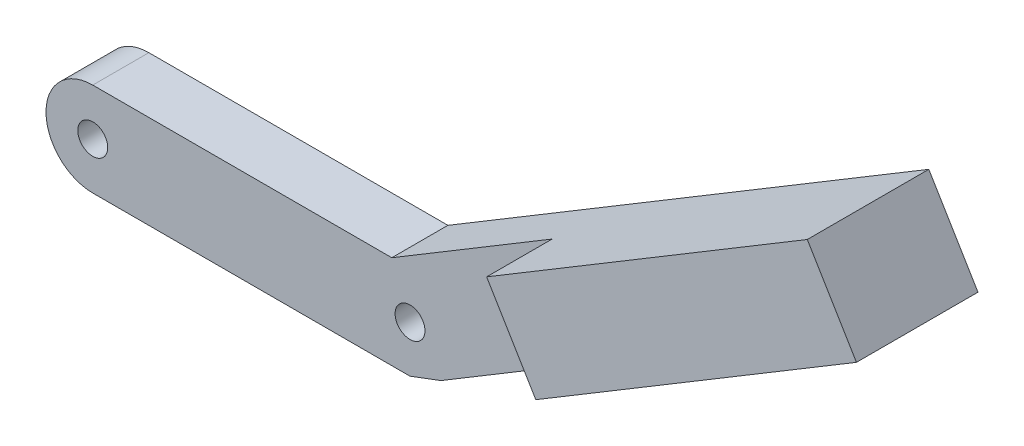
ISO-10303-21;
HEADER;
FILE_DESCRIPTION(('STEP AP214'),'2;1');
FILE_NAME('part.step','',(''),(''),'','','');
FILE_SCHEMA(('AUTOMOTIVE_DESIGN { 1 0 10303 214 1 1 1 1 }'));
ENDSEC;
DATA;
#1=APPLICATION_CONTEXT('core data for automotive mechanical design processes');
#2=APPLICATION_PROTOCOL_DEFINITION('international standard','automotive_design',2000,#1);
#3=PRODUCT_CONTEXT('',#1,'mechanical');
#4=PRODUCT('Part','Part','',(#3));
#5=PRODUCT_RELATED_PRODUCT_CATEGORY('part','',(#4));
#6=PRODUCT_DEFINITION_FORMATION('','',#4);
#7=PRODUCT_DEFINITION_CONTEXT('part definition',#1,'design');
#8=PRODUCT_DEFINITION('design','',#6,#7);
#9=PRODUCT_DEFINITION_SHAPE('','',#8);
#10=(LENGTH_UNIT() NAMED_UNIT(*) SI_UNIT(.MILLI.,.METRE.));
#11=(NAMED_UNIT(*) PLANE_ANGLE_UNIT() SI_UNIT($,.RADIAN.));
#12=(NAMED_UNIT(*) SI_UNIT($,.STERADIAN.) SOLID_ANGLE_UNIT());
#13=UNCERTAINTY_MEASURE_WITH_UNIT(LENGTH_MEASURE(1.E-05),#10,'distance_accuracy_value','');
#14=(GEOMETRIC_REPRESENTATION_CONTEXT(3) GLOBAL_UNCERTAINTY_ASSIGNED_CONTEXT((#13)) GLOBAL_UNIT_ASSIGNED_CONTEXT((#10,
#11,#12)) REPRESENTATION_CONTEXT('',''));
#15=CARTESIAN_POINT('',(0.,0.,0.));
#16=DIRECTION('',(0.,0.,1.));
#17=DIRECTION('',(1.,0.,0.));
#18=AXIS2_PLACEMENT_3D('',#15,#16,#17);
#19=CARTESIAN_POINT('',(5.89562363242974,-15.5969512419142,6.));
#20=DIRECTION('',(0.353581212371453,-0.935403830576897,0.));
#21=DIRECTION('',(0.935403830576897,0.353581212371453,0.));
#22=AXIS2_PLACEMENT_3D('',#19,#20,#21);
#23=PLANE('',#22);
#24=DIRECTION('',(-0.935403830576897,-0.353581212371454,0.));
#25=VECTOR('',#24,1.);
#26=CARTESIAN_POINT('',(5.89562363242974,-15.5969512419142,0.));
#27=LINE('',#26,#25);
#28=CARTESIAN_POINT('',(37.2374122047228,-3.74980326257934,0.));
#29=VERTEX_POINT('',#28);
#30=CARTESIAN_POINT('',(33.93,-5.,0.));
#31=VERTEX_POINT('',#30);
#32=EDGE_CURVE('E138',#29,#31,#27,.T.);
#33=ORIENTED_EDGE('',*,*,#32,.F.);
#34=DIRECTION('',(0.,0.,-1.));
#35=VECTOR('',#34,1.);
#36=CARTESIAN_POINT('',(37.2374122047228,-3.74980326257934,6.));
#37=LINE('',#36,#35);
#38=CARTESIAN_POINT('',(37.2374122047228,-3.74980326257934,6.));
#39=VERTEX_POINT('',#38);
#40=EDGE_CURVE('E11',#39,#29,#37,.T.);
#41=ORIENTED_EDGE('',*,*,#40,.F.);
#42=DIRECTION('',(-0.935403830576897,-0.353581212371454,0.));
#43=VECTOR('',#42,1.);
#44=CARTESIAN_POINT('',(5.89562363242974,-15.5969512419142,6.));
#45=LINE('',#44,#43);
#46=CARTESIAN_POINT('',(33.93,-5.,6.));
#47=VERTEX_POINT('',#46);
#48=EDGE_CURVE('E178',#39,#47,#45,.T.);
#49=ORIENTED_EDGE('',*,*,#48,.T.);
#50=DIRECTION('',(0.,0.,-1.));
#51=VECTOR('',#50,1.);
#52=CARTESIAN_POINT('',(33.93,-5.,6.));
#53=LINE('',#52,#51);
#54=EDGE_CURVE('E87',#47,#31,#53,.T.);
#55=ORIENTED_EDGE('',*,*,#54,.T.);
#56=EDGE_LOOP('',(#33,#41,#49,#55));
#57=FACE_BOUND('',#56,.T.);
#58=ADVANCED_FACE('F35',(#57),#23,.T.);
#59=CARTESIAN_POINT('',(11.5331929336292,-19.1944563654289,6.));
#60=DIRECTION('',(0.515038074910056,-0.857167300702111,0.));
#61=DIRECTION('',(0.857167300702111,0.515038074910056,0.));
#62=AXIS2_PLACEMENT_3D('',#59,#60,#61);
#63=PLANE('',#62);
#64=DIRECTION('',(-0.857167300702111,-0.515038074910056,0.));
#65=VECTOR('',#64,1.);
#66=CARTESIAN_POINT('',(11.5331929336292,-19.1944563654289,0.));
#67=LINE('',#66,#65);
#68=CARTESIAN_POINT('',(88.6674502468495,27.152481232024,0.));
#69=VERTEX_POINT('',#68);
#70=EDGE_CURVE('E141',#69,#29,#67,.T.);
#71=ORIENTED_EDGE('',*,*,#70,.F.);
#72=DIRECTION('',(0.,0.,-1.));
#73=VECTOR('',#72,1.);
#74=CARTESIAN_POINT('',(88.6674502468495,27.152481232024,6.));
#75=LINE('',#74,#73);
#76=CARTESIAN_POINT('',(88.6674502468495,27.152481232024,13.));
#77=VERTEX_POINT('',#76);
#78=EDGE_CURVE('E43',#77,#69,#75,.T.);
#79=ORIENTED_EDGE('',*,*,#78,.F.);
#80=DIRECTION('',(0.857167300702111,0.515038074910057,0.));
#81=VECTOR('',#80,1.);
#82=CARTESIAN_POINT('',(88.6674502468495,27.152481232024,13.));
#83=LINE('',#82,#81);
#84=CARTESIAN_POINT('',(54.380758218765,6.55095823562177,13.));
#85=VERTEX_POINT('',#84);
#86=EDGE_CURVE('E193',#85,#77,#83,.T.);
#87=ORIENTED_EDGE('',*,*,#86,.F.);
#88=DIRECTION('',(0.,0.,-1.));
#89=VECTOR('',#88,1.);
#90=CARTESIAN_POINT('',(54.380758218765,6.55095823562177,13.));
#91=LINE('',#90,#89);
#92=CARTESIAN_POINT('',(54.380758218765,6.55095823562177,6.));
#93=VERTEX_POINT('',#92);
#94=EDGE_CURVE('E188',#85,#93,#91,.T.);
#95=ORIENTED_EDGE('',*,*,#94,.T.);
#96=DIRECTION('',(-0.857167300702111,-0.515038074910056,0.));
#97=VECTOR('',#96,1.);
#98=CARTESIAN_POINT('',(11.5331929336292,-19.1944563654289,6.));
#99=LINE('',#98,#97);
#100=EDGE_CURVE('E94',#93,#39,#99,.T.);
#101=ORIENTED_EDGE('',*,*,#100,.T.);
#102=ORIENTED_EDGE('',*,*,#40,.T.);
#103=EDGE_LOOP('',(#71,#79,#87,#95,#101,#102));
#104=FACE_BOUND('',#103,.T.);
#105=ADVANCED_FACE('F175',(#104),#63,.T.);
#106=CARTESIAN_POINT('',(77.1342573132202,46.346937597453,6.));
#107=DIRECTION('',(-0.85716730070211,-0.515038074910057,0.));
#108=DIRECTION('',(0.515038074910058,-0.85716730070211,0.));
#109=AXIS2_PLACEMENT_3D('',#106,#107,#108);
#110=PLANE('',#109);
#111=DIRECTION('',(-0.515038074910058,0.85716730070211,0.));
#112=VECTOR('',#111,1.);
#113=CARTESIAN_POINT('',(77.1342573132202,46.346937597453,0.));
#114=LINE('',#113,#112);
#115=CARTESIAN_POINT('',(83.4100380421267,35.9022844946034,0.));
#116=VERTEX_POINT('',#115);
#117=EDGE_CURVE('E144',#69,#116,#114,.T.);
#118=ORIENTED_EDGE('',*,*,#117,.T.);
#119=DIRECTION('',(0.,0.,-1.));
#120=VECTOR('',#119,1.);
#121=CARTESIAN_POINT('',(83.4100380421267,35.9022844946034,6.));
#122=LINE('',#121,#120);
#123=CARTESIAN_POINT('',(83.4100380421267,35.9022844946034,13.));
#124=VERTEX_POINT('',#123);
#125=EDGE_CURVE('E159',#124,#116,#122,.T.);
#126=ORIENTED_EDGE('',*,*,#125,.F.);
#127=DIRECTION('',(-0.515038074910058,0.85716730070211,0.));
#128=VECTOR('',#127,1.);
#129=CARTESIAN_POINT('',(83.4100380421267,35.9022844946034,13.));
#130=LINE('',#129,#128);
#131=EDGE_CURVE('E168',#77,#124,#130,.T.);
#132=ORIENTED_EDGE('',*,*,#131,.F.);
#133=ORIENTED_EDGE('',*,*,#78,.T.);
#134=EDGE_LOOP('',(#118,#126,#132,#133));
#135=FACE_BOUND('',#134,.T.);
#136=ADVANCED_FACE('F164',(#135),#110,.F.);
#137=CARTESIAN_POINT('',(6.27578072890635,-10.4446531028496,6.));
#138=DIRECTION('',(-0.515038074910056,0.857167300702111,0.));
#139=DIRECTION('',(-0.857167300702111,-0.515038074910056,0.));
#140=AXIS2_PLACEMENT_3D('',#137,#138,#139);
#141=PLANE('',#140);
#142=DIRECTION('',(0.857167300702111,0.515038074910056,0.));
#143=VECTOR('',#142,1.);
#144=CARTESIAN_POINT('',(6.27578072890635,-10.4446531028496,0.));
#145=LINE('',#144,#143);
#146=CARTESIAN_POINT('',(31.98,5.,0.));
#147=VERTEX_POINT('',#146);
#148=EDGE_CURVE('E147',#147,#116,#145,.T.);
#149=ORIENTED_EDGE('',*,*,#148,.F.);
#150=DIRECTION('',(0.,0.,-1.));
#151=VECTOR('',#150,1.);
#152=CARTESIAN_POINT('',(31.98,5.,6.));
#153=LINE('',#152,#151);
#154=CARTESIAN_POINT('',(31.98,5.,6.));
#155=VERTEX_POINT('',#154);
#156=EDGE_CURVE('E115',#155,#147,#153,.T.);
#157=ORIENTED_EDGE('',*,*,#156,.F.);
#158=DIRECTION('',(0.857167300702111,0.515038074910056,0.));
#159=VECTOR('',#158,1.);
#160=CARTESIAN_POINT('',(6.27578072890635,-10.4446531028496,6.));
#161=LINE('',#160,#159);
#162=CARTESIAN_POINT('',(49.1233460140422,15.3007614982011,6.));
#163=VERTEX_POINT('',#162);
#164=EDGE_CURVE('E125',#155,#163,#161,.T.);
#165=ORIENTED_EDGE('',*,*,#164,.T.);
#166=DIRECTION('',(0.,0.,-1.));
#167=VECTOR('',#166,1.);
#168=CARTESIAN_POINT('',(49.1233460140422,15.3007614982011,13.));
#169=LINE('',#168,#167);
#170=CARTESIAN_POINT('',(49.1233460140422,15.3007614982011,13.));
#171=VERTEX_POINT('',#170);
#172=EDGE_CURVE('E135',#171,#163,#169,.T.);
#173=ORIENTED_EDGE('',*,*,#172,.F.);
#174=DIRECTION('',(-0.857167300702111,-0.515038074910056,0.));
#175=VECTOR('',#174,1.);
#176=CARTESIAN_POINT('',(49.1233460140422,15.3007614982011,13.));
#177=LINE('',#176,#175);
#178=EDGE_CURVE('E191',#124,#171,#177,.T.);
#179=ORIENTED_EDGE('',*,*,#178,.F.);
#180=ORIENTED_EDGE('',*,*,#125,.T.);
#181=EDGE_LOOP('',(#149,#157,#165,#173,#179,#180));
#182=FACE_BOUND('',#181,.T.);
#183=ADVANCED_FACE('F209',(#182),#141,.T.);
#184=CARTESIAN_POINT('',(0.,5.,6.));
#185=DIRECTION('',(0.,1.,0.));
#186=DIRECTION('',(-1.,0.,0.));
#187=AXIS2_PLACEMENT_3D('',#184,#185,#186);
#188=PLANE('',#187);
#189=DIRECTION('',(1.,0.,0.));
#190=VECTOR('',#189,1.);
#191=CARTESIAN_POINT('',(0.,5.,0.));
#192=LINE('',#191,#190);
#193=CARTESIAN_POINT('',(0.,5.,0.));
#194=VERTEX_POINT('',#193);
#195=EDGE_CURVE('E111',#194,#147,#192,.T.);
#196=ORIENTED_EDGE('',*,*,#195,.F.);
#197=DIRECTION('',(0.,0.,-1.));
#198=VECTOR('',#197,1.);
#199=CARTESIAN_POINT('',(0.,5.,6.));
#200=LINE('',#199,#198);
#201=CARTESIAN_POINT('',(0.,5.,6.));
#202=VERTEX_POINT('',#201);
#203=EDGE_CURVE('E105',#202,#194,#200,.T.);
#204=ORIENTED_EDGE('',*,*,#203,.F.);
#205=DIRECTION('',(1.,0.,0.));
#206=VECTOR('',#205,1.);
#207=CARTESIAN_POINT('',(0.,5.,6.));
#208=LINE('',#207,#206);
#209=EDGE_CURVE('E109',#202,#155,#208,.T.);
#210=ORIENTED_EDGE('',*,*,#209,.T.);
#211=ORIENTED_EDGE('',*,*,#156,.T.);
#212=EDGE_LOOP('',(#196,#204,#210,#211));
#213=FACE_BOUND('',#212,.T.);
#214=ADVANCED_FACE('F107',(#213),#188,.T.);
#215=CARTESIAN_POINT('',(0.,0.,6.));
#216=DIRECTION('',(0.,0.,-1.));
#217=DIRECTION('',(-1.,0.,0.));
#218=AXIS2_PLACEMENT_3D('',#215,#216,#217);
#219=CYLINDRICAL_SURFACE('',#218,5.);
#220=CARTESIAN_POINT('',(0.,0.,0.));
#221=DIRECTION('',(0.,0.,1.));
#222=DIRECTION('',(1.,0.,0.));
#223=AXIS2_PLACEMENT_3D('',#220,#221,#222);
#224=CIRCLE('',#223,5.);
#225=CARTESIAN_POINT('',(0.,-5.,0.));
#226=VERTEX_POINT('',#225);
#227=EDGE_CURVE('E151',#194,#226,#224,.T.);
#228=ORIENTED_EDGE('',*,*,#227,.T.);
#229=DIRECTION('',(0.,0.,-1.));
#230=VECTOR('',#229,1.);
#231=CARTESIAN_POINT('',(0.,-5.,6.));
#232=LINE('',#231,#230);
#233=CARTESIAN_POINT('',(0.,-5.,6.));
#234=VERTEX_POINT('',#233);
#235=EDGE_CURVE('E116',#234,#226,#232,.T.);
#236=ORIENTED_EDGE('',*,*,#235,.F.);
#237=CARTESIAN_POINT('',(0.,0.,6.));
#238=DIRECTION('',(0.,0.,1.));
#239=DIRECTION('',(1.,0.,0.));
#240=AXIS2_PLACEMENT_3D('',#237,#238,#239);
#241=CIRCLE('',#240,5.);
#242=EDGE_CURVE('E119',#202,#234,#241,.T.);
#243=ORIENTED_EDGE('',*,*,#242,.F.);
#244=ORIENTED_EDGE('',*,*,#203,.T.);
#245=EDGE_LOOP('',(#228,#236,#243,#244));
#246=FACE_BOUND('',#245,.T.);
#247=ADVANCED_FACE('F120',(#246),#219,.T.);
#248=CARTESIAN_POINT('',(0.,0.,6.));
#249=DIRECTION('',(0.,0.,-1.));
#250=DIRECTION('',(-1.,0.,0.));
#251=AXIS2_PLACEMENT_3D('',#248,#249,#250);
#252=CYLINDRICAL_SURFACE('',#251,1.6);
#253=CARTESIAN_POINT('',(0.,0.,6.));
#254=DIRECTION('',(0.,0.,1.));
#255=DIRECTION('',(1.,0.,0.));
#256=AXIS2_PLACEMENT_3D('',#253,#254,#255);
#257=CIRCLE('',#256,1.6);
#258=CARTESIAN_POINT('',(1.6,0.,6.));
#259=VERTEX_POINT('',#258);
#260=EDGE_CURVE('E179',#259,#259,#257,.T.);
#261=ORIENTED_EDGE('',*,*,#260,.T.);
#262=EDGE_LOOP('',(#261));
#263=FACE_BOUND('',#262,.T.);
#264=CARTESIAN_POINT('',(0.,0.,0.));
#265=DIRECTION('',(0.,0.,1.));
#266=DIRECTION('',(1.,0.,0.));
#267=AXIS2_PLACEMENT_3D('',#264,#265,#266);
#268=CIRCLE('',#267,1.6);
#269=CARTESIAN_POINT('',(1.6,0.,0.));
#270=VERTEX_POINT('',#269);
#271=EDGE_CURVE('E134',#270,#270,#268,.T.);
#272=ORIENTED_EDGE('',*,*,#271,.F.);
#273=EDGE_LOOP('',(#272));
#274=FACE_BOUND('',#273,.T.);
#275=ADVANCED_FACE('F231',(#263,#274),#252,.F.);
#276=CARTESIAN_POINT('',(33.93,0.,6.));
#277=DIRECTION('',(0.,0.,-1.));
#278=DIRECTION('',(-1.,0.,0.));
#279=AXIS2_PLACEMENT_3D('',#276,#277,#278);
#280=CYLINDRICAL_SURFACE('',#279,1.60000000000001);
#281=CARTESIAN_POINT('',(33.93,0.,6.));
#282=DIRECTION('',(0.,0.,1.));
#283=DIRECTION('',(1.,0.,0.));
#284=AXIS2_PLACEMENT_3D('',#281,#282,#283);
#285=CIRCLE('',#284,1.60000000000001);
#286=CARTESIAN_POINT('',(35.53,0.,6.));
#287=VERTEX_POINT('',#286);
#288=EDGE_CURVE('E155',#287,#287,#285,.T.);
#289=ORIENTED_EDGE('',*,*,#288,.T.);
#290=EDGE_LOOP('',(#289));
#291=FACE_BOUND('',#290,.T.);
#292=CARTESIAN_POINT('',(33.93,0.,0.));
#293=DIRECTION('',(0.,0.,1.));
#294=DIRECTION('',(1.,0.,0.));
#295=AXIS2_PLACEMENT_3D('',#292,#293,#294);
#296=CIRCLE('',#295,1.60000000000001);
#297=CARTESIAN_POINT('',(35.53,0.,0.));
#298=VERTEX_POINT('',#297);
#299=EDGE_CURVE('E131',#298,#298,#296,.T.);
#300=ORIENTED_EDGE('',*,*,#299,.F.);
#301=EDGE_LOOP('',(#300));
#302=FACE_BOUND('',#301,.T.);
#303=ADVANCED_FACE('F37',(#291,#302),#280,.F.);
#304=CARTESIAN_POINT('',(0.,-5.,6.));
#305=DIRECTION('',(0.,1.,0.));
#306=DIRECTION('',(-1.,0.,0.));
#307=AXIS2_PLACEMENT_3D('',#304,#305,#306);
#308=PLANE('',#307);
#309=DIRECTION('',(1.,0.,0.));
#310=VECTOR('',#309,1.);
#311=CARTESIAN_POINT('',(0.,-5.,0.));
#312=LINE('',#311,#310);
#313=EDGE_CURVE('E153',#226,#31,#312,.T.);
#314=ORIENTED_EDGE('',*,*,#313,.T.);
#315=ORIENTED_EDGE('',*,*,#54,.F.);
#316=DIRECTION('',(1.,0.,0.));
#317=VECTOR('',#316,1.);
#318=CARTESIAN_POINT('',(0.,-5.,6.));
#319=LINE('',#318,#317);
#320=EDGE_CURVE('E58',#234,#47,#319,.T.);
#321=ORIENTED_EDGE('',*,*,#320,.F.);
#322=ORIENTED_EDGE('',*,*,#235,.T.);
#323=EDGE_LOOP('',(#314,#315,#321,#322));
#324=FACE_BOUND('',#323,.T.);
#325=ADVANCED_FACE('F177',(#324),#308,.F.);
#326=CARTESIAN_POINT('',(0.,0.,6.));
#327=DIRECTION('',(0.,0.,1.));
#328=DIRECTION('',(1.,0.,0.));
#329=AXIS2_PLACEMENT_3D('',#326,#327,#328);
#330=PLANE('',#329);
#331=DIRECTION('',(0.515038074910056,-0.857167300702111,0.));
#332=VECTOR('',#331,1.);
#333=CARTESIAN_POINT('',(54.380758218765,6.55095823562177,6.));
#334=LINE('',#333,#332);
#335=EDGE_CURVE('E50',#163,#93,#334,.T.);
#336=ORIENTED_EDGE('',*,*,#335,.F.);
#337=ORIENTED_EDGE('',*,*,#164,.F.);
#338=ORIENTED_EDGE('',*,*,#209,.F.);
#339=ORIENTED_EDGE('',*,*,#242,.T.);
#340=ORIENTED_EDGE('',*,*,#320,.T.);
#341=ORIENTED_EDGE('',*,*,#48,.F.);
#342=ORIENTED_EDGE('',*,*,#100,.F.);
#343=EDGE_LOOP('',(#336,#337,#338,#339,#340,#341,#342));
#344=FACE_BOUND('',#343,.T.);
#345=ORIENTED_EDGE('',*,*,#288,.F.);
#346=EDGE_LOOP('',(#345));
#347=FACE_BOUND('',#346,.T.);
#348=ORIENTED_EDGE('',*,*,#260,.F.);
#349=EDGE_LOOP('',(#348));
#350=FACE_BOUND('',#349,.T.);
#351=ADVANCED_FACE('F123',(#344,#347,#350),#330,.T.);
#352=CARTESIAN_POINT('',(0.,0.,0.));
#353=DIRECTION('',(0.,0.,1.));
#354=DIRECTION('',(1.,0.,0.));
#355=AXIS2_PLACEMENT_3D('',#352,#353,#354);
#356=PLANE('',#355);
#357=ORIENTED_EDGE('',*,*,#299,.T.);
#358=EDGE_LOOP('',(#357));
#359=FACE_BOUND('',#358,.T.);
#360=ORIENTED_EDGE('',*,*,#271,.T.);
#361=EDGE_LOOP('',(#360));
#362=FACE_BOUND('',#361,.T.);
#363=ORIENTED_EDGE('',*,*,#32,.T.);
#364=ORIENTED_EDGE('',*,*,#313,.F.);
#365=ORIENTED_EDGE('',*,*,#227,.F.);
#366=ORIENTED_EDGE('',*,*,#195,.T.);
#367=ORIENTED_EDGE('',*,*,#148,.T.);
#368=ORIENTED_EDGE('',*,*,#117,.F.);
#369=ORIENTED_EDGE('',*,*,#70,.T.);
#370=EDGE_LOOP('',(#363,#364,#365,#366,#367,#368,#369));
#371=FACE_BOUND('',#370,.T.);
#372=ADVANCED_FACE('F173',(#359,#362,#371),#356,.F.);
#373=CARTESIAN_POINT('',(54.380758218765,6.55095823562177,13.));
#374=DIRECTION('',(0.857167300702111,0.515038074910056,0.));
#375=DIRECTION('',(-0.515038074910056,0.857167300702111,0.));
#376=AXIS2_PLACEMENT_3D('',#373,#374,#375);
#377=PLANE('',#376);
#378=ORIENTED_EDGE('',*,*,#335,.T.);
#379=ORIENTED_EDGE('',*,*,#94,.F.);
#380=DIRECTION('',(0.515038074910056,-0.857167300702111,0.));
#381=VECTOR('',#380,1.);
#382=CARTESIAN_POINT('',(54.380758218765,6.55095823562177,13.));
#383=LINE('',#382,#381);
#384=EDGE_CURVE('E195',#171,#85,#383,.T.);
#385=ORIENTED_EDGE('',*,*,#384,.F.);
#386=ORIENTED_EDGE('',*,*,#172,.T.);
#387=EDGE_LOOP('',(#378,#379,#385,#386));
#388=FACE_BOUND('',#387,.T.);
#389=ADVANCED_FACE('F211',(#388),#377,.F.);
#390=CARTESIAN_POINT('',(0.,0.,13.));
#391=DIRECTION('',(0.,0.,-1.));
#392=DIRECTION('',(-1.,0.,0.));
#393=AXIS2_PLACEMENT_3D('',#390,#391,#392);
#394=PLANE('',#393);
#395=ORIENTED_EDGE('',*,*,#178,.T.);
#396=ORIENTED_EDGE('',*,*,#384,.T.);
#397=ORIENTED_EDGE('',*,*,#86,.T.);
#398=ORIENTED_EDGE('',*,*,#131,.T.);
#399=EDGE_LOOP('',(#395,#396,#397,#398));
#400=FACE_BOUND('',#399,.T.);
#401=ADVANCED_FACE('F203',(#400),#394,.F.);
#402=CLOSED_SHELL('',(#58,#105,#136,#183,#214,#247,#275,#303,#325,#351,#372,#389,#401));
#403=MANIFOLD_SOLID_BREP('B2',#402);
#404=ADVANCED_BREP_SHAPE_REPRESENTATION('',(#18,#403),#14);
#405=SHAPE_DEFINITION_REPRESENTATION(#9,#404);
ENDSEC;
END-ISO-10303-21;
